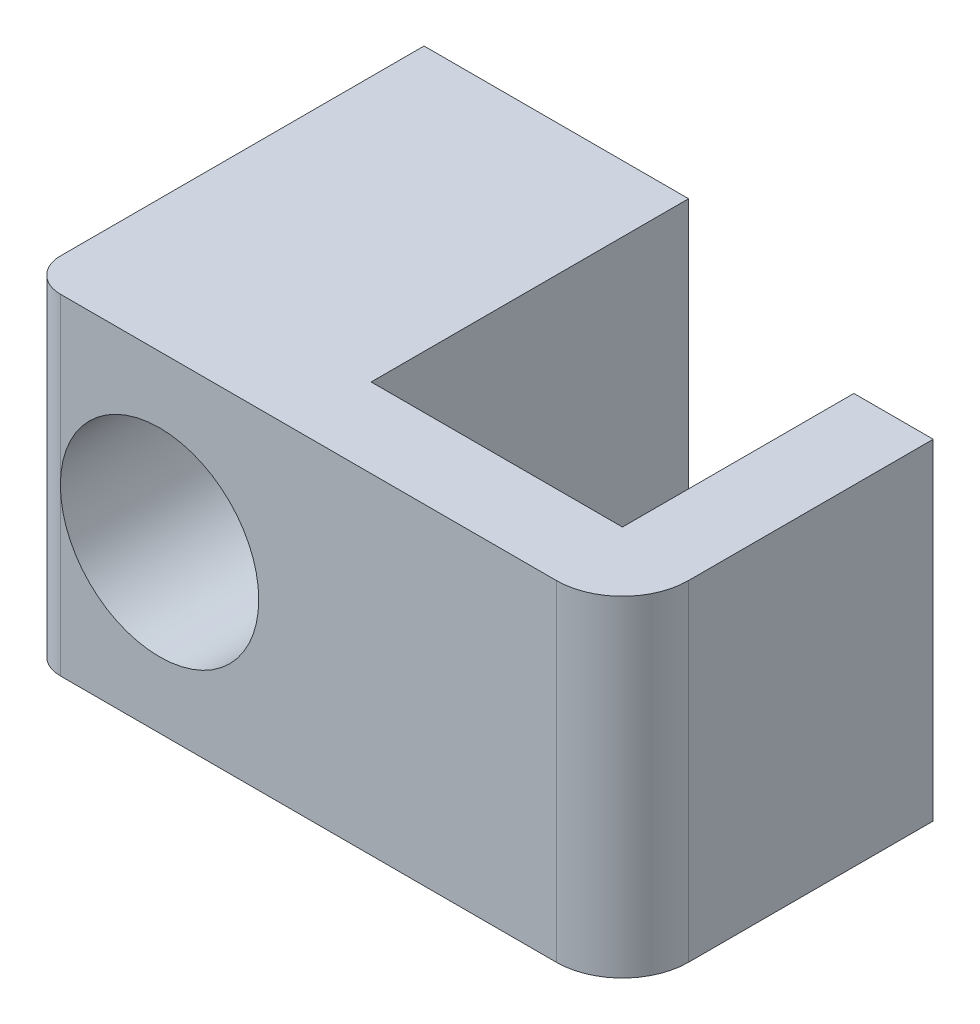
ISO-10303-21;
HEADER;
FILE_DESCRIPTION(('STEP AP214'),'2;1');
FILE_NAME('part.step','',(''),(''),'','','');
FILE_SCHEMA(('AUTOMOTIVE_DESIGN { 1 0 10303 214 1 1 1 1 }'));
ENDSEC;
DATA;
#1=APPLICATION_CONTEXT('core data for automotive mechanical design processes');
#2=APPLICATION_PROTOCOL_DEFINITION('international standard','automotive_design',2000,#1);
#3=PRODUCT_CONTEXT('',#1,'mechanical');
#4=PRODUCT('Part','Part','',(#3));
#5=PRODUCT_RELATED_PRODUCT_CATEGORY('part','',(#4));
#6=PRODUCT_DEFINITION_FORMATION('','',#4);
#7=PRODUCT_DEFINITION_CONTEXT('part definition',#1,'design');
#8=PRODUCT_DEFINITION('design','',#6,#7);
#9=PRODUCT_DEFINITION_SHAPE('','',#8);
#10=(LENGTH_UNIT() NAMED_UNIT(*) SI_UNIT(.MILLI.,.METRE.));
#11=(NAMED_UNIT(*) PLANE_ANGLE_UNIT() SI_UNIT($,.RADIAN.));
#12=(NAMED_UNIT(*) SI_UNIT($,.STERADIAN.) SOLID_ANGLE_UNIT());
#13=UNCERTAINTY_MEASURE_WITH_UNIT(LENGTH_MEASURE(1.E-05),#10,'distance_accuracy_value','');
#14=(GEOMETRIC_REPRESENTATION_CONTEXT(3) GLOBAL_UNCERTAINTY_ASSIGNED_CONTEXT((#13)) GLOBAL_UNIT_ASSIGNED_CONTEXT((#10,
#11,#12)) REPRESENTATION_CONTEXT('',''));
#15=CARTESIAN_POINT('',(0.,0.,0.));
#16=DIRECTION('',(0.,0.,1.));
#17=DIRECTION('',(1.,0.,0.));
#18=AXIS2_PLACEMENT_3D('',#15,#16,#17);
#19=CARTESIAN_POINT('',(7.,2.5,4.8));
#20=DIRECTION('',(0.,0.,1.));
#21=DIRECTION('',(0.,-1.,0.));
#22=AXIS2_PLACEMENT_3D('',#19,#20,#21);
#23=PLANE('',#22);
#24=DIRECTION('',(0.,1.,0.));
#25=VECTOR('',#24,1.);
#26=CARTESIAN_POINT('',(5.8,2.5,4.8));
#27=LINE('',#26,#25);
#28=CARTESIAN_POINT('',(5.8,-2.5,4.8));
#29=VERTEX_POINT('',#28);
#30=CARTESIAN_POINT('',(5.8,2.5,4.8));
#31=VERTEX_POINT('',#30);
#32=EDGE_CURVE('E139',#29,#31,#27,.T.);
#33=ORIENTED_EDGE('',*,*,#32,.F.);
#34=DIRECTION('',(-1.,0.,0.));
#35=VECTOR('',#34,1.);
#36=CARTESIAN_POINT('',(7.,-2.5,4.8));
#37=LINE('',#36,#35);
#38=CARTESIAN_POINT('',(2.,-2.5,4.8));
#39=VERTEX_POINT('',#38);
#40=EDGE_CURVE('E170',#29,#39,#37,.T.);
#41=ORIENTED_EDGE('',*,*,#40,.T.);
#42=DIRECTION('',(0.,1.,0.));
#43=VECTOR('',#42,1.);
#44=CARTESIAN_POINT('',(2.,2.5,4.8));
#45=LINE('',#44,#43);
#46=CARTESIAN_POINT('',(2.,2.5,4.8));
#47=VERTEX_POINT('',#46);
#48=EDGE_CURVE('E152',#39,#47,#45,.T.);
#49=ORIENTED_EDGE('',*,*,#48,.T.);
#50=DIRECTION('',(-1.,0.,0.));
#51=VECTOR('',#50,1.);
#52=CARTESIAN_POINT('',(7.,2.5,4.8));
#53=LINE('',#52,#51);
#54=EDGE_CURVE('E123',#31,#47,#53,.T.);
#55=ORIENTED_EDGE('',*,*,#54,.F.);
#56=EDGE_LOOP('',(#33,#41,#49,#55));
#57=FACE_BOUND('',#56,.T.);
#58=ADVANCED_FACE('F34',(#57),#23,.F.);
#59=CARTESIAN_POINT('',(2.,-2.5,6.));
#60=DIRECTION('',(-1.,0.,0.));
#61=DIRECTION('',(0.,0.,1.));
#62=AXIS2_PLACEMENT_3D('',#59,#60,#61);
#63=PLANE('',#62);
#64=ORIENTED_EDGE('',*,*,#48,.F.);
#65=DIRECTION('',(0.,0.,-1.));
#66=VECTOR('',#65,1.);
#67=CARTESIAN_POINT('',(2.,-2.5,6.));
#68=LINE('',#67,#66);
#69=CARTESIAN_POINT('',(2.,-2.5,0.));
#70=VERTEX_POINT('',#69);
#71=EDGE_CURVE('E162',#39,#70,#68,.T.);
#72=ORIENTED_EDGE('',*,*,#71,.T.);
#73=DIRECTION('',(0.,1.,0.));
#74=VECTOR('',#73,1.);
#75=CARTESIAN_POINT('',(2.,-2.5,0.));
#76=LINE('',#75,#74);
#77=CARTESIAN_POINT('',(2.,2.5,0.));
#78=VERTEX_POINT('',#77);
#79=EDGE_CURVE('E172',#70,#78,#76,.T.);
#80=ORIENTED_EDGE('',*,*,#79,.T.);
#81=DIRECTION('',(0.,0.,-1.));
#82=VECTOR('',#81,1.);
#83=CARTESIAN_POINT('',(2.,2.5,6.));
#84=LINE('',#83,#82);
#85=EDGE_CURVE('E175',#47,#78,#84,.T.);
#86=ORIENTED_EDGE('',*,*,#85,.F.);
#87=EDGE_LOOP('',(#64,#72,#80,#86));
#88=FACE_BOUND('',#87,.T.);
#89=ADVANCED_FACE('F210',(#88),#63,.F.);
#90=CARTESIAN_POINT('',(-2.,2.5,6.));
#91=DIRECTION('',(0.,-1.,0.));
#92=DIRECTION('',(0.,0.,-1.));
#93=AXIS2_PLACEMENT_3D('',#90,#91,#92);
#94=PLANE('',#93);
#95=DIRECTION('',(0.,0.,-1.));
#96=VECTOR('',#95,1.);
#97=CARTESIAN_POINT('',(-2.,2.5,6.));
#98=LINE('',#97,#96);
#99=CARTESIAN_POINT('',(-2.,2.5,5.5));
#100=VERTEX_POINT('',#99);
#101=CARTESIAN_POINT('',(-2.,2.5,0.));
#102=VERTEX_POINT('',#101);
#103=EDGE_CURVE('E239',#100,#102,#98,.T.);
#104=ORIENTED_EDGE('',*,*,#103,.F.);
#105=CARTESIAN_POINT('',(-1.5,2.5,5.5));
#106=DIRECTION('',(0.,-1.,0.));
#107=DIRECTION('',(0.,0.,-1.));
#108=AXIS2_PLACEMENT_3D('',#105,#106,#107);
#109=CIRCLE('',#108,0.5);
#110=CARTESIAN_POINT('',(-1.5,2.5,6.));
#111=VERTEX_POINT('',#110);
#112=EDGE_CURVE('E11',#100,#111,#109,.F.);
#113=ORIENTED_EDGE('',*,*,#112,.T.);
#114=DIRECTION('',(-1.,0.,0.));
#115=VECTOR('',#114,1.);
#116=CARTESIAN_POINT('',(-2.,2.5,6.));
#117=LINE('',#116,#115);
#118=CARTESIAN_POINT('',(6.,2.5,6.));
#119=VERTEX_POINT('',#118);
#120=EDGE_CURVE('E156',#119,#111,#117,.T.);
#121=ORIENTED_EDGE('',*,*,#120,.F.);
#122=CARTESIAN_POINT('',(6.,2.5,5.));
#123=DIRECTION('',(0.,-1.,0.));
#124=DIRECTION('',(0.,0.,-1.));
#125=AXIS2_PLACEMENT_3D('',#122,#123,#124);
#126=CIRCLE('',#125,1.);
#127=CARTESIAN_POINT('',(7.,2.5,5.));
#128=VERTEX_POINT('',#127);
#129=EDGE_CURVE('E179',#119,#128,#126,.F.);
#130=ORIENTED_EDGE('',*,*,#129,.T.);
#131=DIRECTION('',(0.,0.,1.));
#132=VECTOR('',#131,1.);
#133=CARTESIAN_POINT('',(7.,2.5,6.));
#134=LINE('',#133,#132);
#135=CARTESIAN_POINT('',(7.,2.5,1.3));
#136=VERTEX_POINT('',#135);
#137=EDGE_CURVE('E124',#136,#128,#134,.T.);
#138=ORIENTED_EDGE('',*,*,#137,.F.);
#139=DIRECTION('',(1.,0.,0.));
#140=VECTOR('',#139,1.);
#141=CARTESIAN_POINT('',(7.,2.5,1.3));
#142=LINE('',#141,#140);
#143=CARTESIAN_POINT('',(5.8,2.5,1.3));
#144=VERTEX_POINT('',#143);
#145=EDGE_CURVE('E138',#144,#136,#142,.T.);
#146=ORIENTED_EDGE('',*,*,#145,.F.);
#147=DIRECTION('',(0.,0.,1.));
#148=VECTOR('',#147,1.);
#149=CARTESIAN_POINT('',(5.8,2.5,1.3));
#150=LINE('',#149,#148);
#151=EDGE_CURVE('E147',#144,#31,#150,.T.);
#152=ORIENTED_EDGE('',*,*,#151,.T.);
#153=ORIENTED_EDGE('',*,*,#54,.T.);
#154=ORIENTED_EDGE('',*,*,#85,.T.);
#155=DIRECTION('',(-1.,0.,0.));
#156=VECTOR('',#155,1.);
#157=CARTESIAN_POINT('',(-2.,2.5,0.));
#158=LINE('',#157,#156);
#159=EDGE_CURVE('E241',#78,#102,#158,.T.);
#160=ORIENTED_EDGE('',*,*,#159,.T.);
#161=EDGE_LOOP('',(#104,#113,#121,#130,#138,#146,#152,#153,#154,#160));
#162=FACE_BOUND('',#161,.T.);
#163=ADVANCED_FACE('F216',(#162),#94,.F.);
#164=CARTESIAN_POINT('',(-2.,-2.5,6.));
#165=DIRECTION('',(1.,0.,0.));
#166=DIRECTION('',(0.,0.,-1.));
#167=AXIS2_PLACEMENT_3D('',#164,#165,#166);
#168=PLANE('',#167);
#169=DIRECTION('',(0.,0.,-1.));
#170=VECTOR('',#169,1.);
#171=CARTESIAN_POINT('',(-2.,-2.5,6.));
#172=LINE('',#171,#170);
#173=CARTESIAN_POINT('',(-2.,-2.5,5.5));
#174=VERTEX_POINT('',#173);
#175=CARTESIAN_POINT('',(-2.,-2.5,0.));
#176=VERTEX_POINT('',#175);
#177=EDGE_CURVE('E244',#174,#176,#172,.T.);
#178=ORIENTED_EDGE('',*,*,#177,.F.);
#179=DIRECTION('',(0.,-1.,0.));
#180=VECTOR('',#179,1.);
#181=CARTESIAN_POINT('',(-2.,-2.5,5.5));
#182=LINE('',#181,#180);
#183=EDGE_CURVE('E42',#174,#100,#182,.F.);
#184=ORIENTED_EDGE('',*,*,#183,.T.);
#185=ORIENTED_EDGE('',*,*,#103,.T.);
#186=DIRECTION('',(0.,-1.,0.));
#187=VECTOR('',#186,1.);
#188=CARTESIAN_POINT('',(-2.,-2.5,0.));
#189=LINE('',#188,#187);
#190=EDGE_CURVE('E253',#102,#176,#189,.T.);
#191=ORIENTED_EDGE('',*,*,#190,.T.);
#192=EDGE_LOOP('',(#178,#184,#185,#191));
#193=FACE_BOUND('',#192,.T.);
#194=ADVANCED_FACE('F231',(#193),#168,.F.);
#195=CARTESIAN_POINT('',(-2.,-2.5,6.));
#196=DIRECTION('',(0.,1.,0.));
#197=DIRECTION('',(0.,0.,1.));
#198=AXIS2_PLACEMENT_3D('',#195,#196,#197);
#199=PLANE('',#198);
#200=DIRECTION('',(1.,0.,0.));
#201=VECTOR('',#200,1.);
#202=CARTESIAN_POINT('',(-2.,-2.5,6.));
#203=LINE('',#202,#201);
#204=CARTESIAN_POINT('',(-1.5,-2.5,6.));
#205=VERTEX_POINT('',#204);
#206=CARTESIAN_POINT('',(6.,-2.5,6.));
#207=VERTEX_POINT('',#206);
#208=EDGE_CURVE('E246',#205,#207,#203,.T.);
#209=ORIENTED_EDGE('',*,*,#208,.F.);
#210=CARTESIAN_POINT('',(-1.5,-2.5,5.5));
#211=DIRECTION('',(0.,1.,0.));
#212=DIRECTION('',(0.,0.,1.));
#213=AXIS2_PLACEMENT_3D('',#210,#211,#212);
#214=CIRCLE('',#213,0.5);
#215=EDGE_CURVE('E56',#205,#174,#214,.F.);
#216=ORIENTED_EDGE('',*,*,#215,.T.);
#217=ORIENTED_EDGE('',*,*,#177,.T.);
#218=DIRECTION('',(1.,0.,0.));
#219=VECTOR('',#218,1.);
#220=CARTESIAN_POINT('',(-2.,-2.5,0.));
#221=LINE('',#220,#219);
#222=EDGE_CURVE('E248',#176,#70,#221,.T.);
#223=ORIENTED_EDGE('',*,*,#222,.T.);
#224=ORIENTED_EDGE('',*,*,#71,.F.);
#225=ORIENTED_EDGE('',*,*,#40,.F.);
#226=DIRECTION('',(0.,0.,1.));
#227=VECTOR('',#226,1.);
#228=CARTESIAN_POINT('',(5.8,-2.5,1.3));
#229=LINE('',#228,#227);
#230=CARTESIAN_POINT('',(5.8,-2.5,1.3));
#231=VERTEX_POINT('',#230);
#232=EDGE_CURVE('E130',#231,#29,#229,.T.);
#233=ORIENTED_EDGE('',*,*,#232,.F.);
#234=DIRECTION('',(-1.,0.,0.));
#235=VECTOR('',#234,1.);
#236=CARTESIAN_POINT('',(5.8,-2.5,1.3));
#237=LINE('',#236,#235);
#238=CARTESIAN_POINT('',(7.,-2.5,1.3));
#239=VERTEX_POINT('',#238);
#240=EDGE_CURVE('E127',#239,#231,#237,.T.);
#241=ORIENTED_EDGE('',*,*,#240,.F.);
#242=DIRECTION('',(0.,0.,-1.));
#243=VECTOR('',#242,1.);
#244=CARTESIAN_POINT('',(7.,-2.5,4.8));
#245=LINE('',#244,#243);
#246=CARTESIAN_POINT('',(7.,-2.5,5.));
#247=VERTEX_POINT('',#246);
#248=EDGE_CURVE('E114',#247,#239,#245,.T.);
#249=ORIENTED_EDGE('',*,*,#248,.F.);
#250=CARTESIAN_POINT('',(6.,-2.5,5.));
#251=DIRECTION('',(0.,1.,0.));
#252=DIRECTION('',(0.,0.,1.));
#253=AXIS2_PLACEMENT_3D('',#250,#251,#252);
#254=CIRCLE('',#253,1.);
#255=EDGE_CURVE('E174',#247,#207,#254,.F.);
#256=ORIENTED_EDGE('',*,*,#255,.T.);
#257=EDGE_LOOP('',(#209,#216,#217,#223,#224,#225,#233,#241,#249,#256));
#258=FACE_BOUND('',#257,.T.);
#259=ADVANCED_FACE('F128',(#258),#199,.F.);
#260=CARTESIAN_POINT('',(2.,2.5,6.));
#261=DIRECTION('',(0.,0.,-1.));
#262=DIRECTION('',(-1.,0.,0.));
#263=AXIS2_PLACEMENT_3D('',#260,#261,#262);
#264=PLANE('',#263);
#265=ORIENTED_EDGE('',*,*,#120,.T.);
#266=DIRECTION('',(0.,-1.,0.));
#267=VECTOR('',#266,1.);
#268=CARTESIAN_POINT('',(-1.5,2.5,6.));
#269=LINE('',#268,#267);
#270=CARTESIAN_POINT('',(-1.5,0.,6.));
#271=VERTEX_POINT('',#270);
#272=EDGE_CURVE('E185',#111,#271,#269,.T.);
#273=ORIENTED_EDGE('',*,*,#272,.T.);
#274=CARTESIAN_POINT('',(0.,0.,6.));
#275=DIRECTION('',(0.,0.,1.));
#276=DIRECTION('',(1.,0.,0.));
#277=AXIS2_PLACEMENT_3D('',#274,#275,#276);
#278=CIRCLE('',#277,1.5);
#279=EDGE_CURVE('E144',#271,#271,#278,.T.);
#280=ORIENTED_EDGE('',*,*,#279,.F.);
#281=DIRECTION('',(0.,-1.,0.));
#282=VECTOR('',#281,1.);
#283=CARTESIAN_POINT('',(-1.5,2.5,6.));
#284=LINE('',#283,#282);
#285=EDGE_CURVE('E181',#271,#205,#284,.T.);
#286=ORIENTED_EDGE('',*,*,#285,.T.);
#287=ORIENTED_EDGE('',*,*,#208,.T.);
#288=DIRECTION('',(0.,-1.,0.));
#289=VECTOR('',#288,1.);
#290=CARTESIAN_POINT('',(6.,2.5,6.));
#291=LINE('',#290,#289);
#292=EDGE_CURVE('E177',#207,#119,#291,.F.);
#293=ORIENTED_EDGE('',*,*,#292,.T.);
#294=EDGE_LOOP('',(#265,#273,#280,#286,#287,#293));
#295=FACE_BOUND('',#294,.T.);
#296=ADVANCED_FACE('F193',(#295),#264,.F.);
#297=CARTESIAN_POINT('',(2.,2.5,0.));
#298=DIRECTION('',(0.,0.,-1.));
#299=DIRECTION('',(-1.,0.,0.));
#300=AXIS2_PLACEMENT_3D('',#297,#298,#299);
#301=PLANE('',#300);
#302=CARTESIAN_POINT('',(0.,0.,0.));
#303=DIRECTION('',(0.,0.,-1.));
#304=DIRECTION('',(-1.,0.,0.));
#305=AXIS2_PLACEMENT_3D('',#302,#303,#304);
#306=CIRCLE('',#305,1.5);
#307=CARTESIAN_POINT('',(-1.5,0.,0.));
#308=VERTEX_POINT('',#307);
#309=EDGE_CURVE('E141',#308,#308,#306,.T.);
#310=ORIENTED_EDGE('',*,*,#309,.F.);
#311=EDGE_LOOP('',(#310));
#312=FACE_BOUND('',#311,.T.);
#313=ORIENTED_EDGE('',*,*,#79,.F.);
#314=ORIENTED_EDGE('',*,*,#222,.F.);
#315=ORIENTED_EDGE('',*,*,#190,.F.);
#316=ORIENTED_EDGE('',*,*,#159,.F.);
#317=EDGE_LOOP('',(#313,#314,#315,#316));
#318=FACE_BOUND('',#317,.T.);
#319=ADVANCED_FACE('F225',(#312,#318),#301,.T.);
#320=CARTESIAN_POINT('',(7.,2.5,4.8));
#321=DIRECTION('',(-1.,0.,0.));
#322=DIRECTION('',(0.,0.,1.));
#323=AXIS2_PLACEMENT_3D('',#320,#321,#322);
#324=PLANE('',#323);
#325=ORIENTED_EDGE('',*,*,#137,.T.);
#326=DIRECTION('',(0.,-1.,0.));
#327=VECTOR('',#326,1.);
#328=CARTESIAN_POINT('',(7.,2.5,5.));
#329=LINE('',#328,#327);
#330=EDGE_CURVE('E121',#128,#247,#329,.T.);
#331=ORIENTED_EDGE('',*,*,#330,.T.);
#332=ORIENTED_EDGE('',*,*,#248,.T.);
#333=DIRECTION('',(0.,-1.,0.));
#334=VECTOR('',#333,1.);
#335=CARTESIAN_POINT('',(7.,-2.5,1.3));
#336=LINE('',#335,#334);
#337=EDGE_CURVE('E119',#136,#239,#336,.T.);
#338=ORIENTED_EDGE('',*,*,#337,.F.);
#339=EDGE_LOOP('',(#325,#331,#332,#338));
#340=FACE_BOUND('',#339,.T.);
#341=ADVANCED_FACE('F117',(#340),#324,.F.);
#342=CARTESIAN_POINT('',(5.8,2.5,1.3));
#343=DIRECTION('',(1.,0.,0.));
#344=DIRECTION('',(0.,1.,0.));
#345=AXIS2_PLACEMENT_3D('',#342,#343,#344);
#346=PLANE('',#345);
#347=ORIENTED_EDGE('',*,*,#32,.T.);
#348=ORIENTED_EDGE('',*,*,#151,.F.);
#349=DIRECTION('',(0.,1.,0.));
#350=VECTOR('',#349,1.);
#351=CARTESIAN_POINT('',(5.8,2.5,1.3));
#352=LINE('',#351,#350);
#353=EDGE_CURVE('E133',#231,#144,#352,.T.);
#354=ORIENTED_EDGE('',*,*,#353,.F.);
#355=ORIENTED_EDGE('',*,*,#232,.T.);
#356=EDGE_LOOP('',(#347,#348,#354,#355));
#357=FACE_BOUND('',#356,.T.);
#358=ADVANCED_FACE('F269',(#357),#346,.F.);
#359=CARTESIAN_POINT('',(7.,2.5,1.3));
#360=DIRECTION('',(0.,0.,1.));
#361=DIRECTION('',(0.,-1.,0.));
#362=AXIS2_PLACEMENT_3D('',#359,#360,#361);
#363=PLANE('',#362);
#364=ORIENTED_EDGE('',*,*,#337,.T.);
#365=ORIENTED_EDGE('',*,*,#240,.T.);
#366=ORIENTED_EDGE('',*,*,#353,.T.);
#367=ORIENTED_EDGE('',*,*,#145,.T.);
#368=EDGE_LOOP('',(#364,#365,#366,#367));
#369=FACE_BOUND('',#368,.T.);
#370=ADVANCED_FACE('F136',(#369),#363,.F.);
#371=CARTESIAN_POINT('',(6.,2.5,5.));
#372=DIRECTION('',(0.,-1.,0.));
#373=DIRECTION('',(0.,0.,-1.));
#374=AXIS2_PLACEMENT_3D('',#371,#372,#373);
#375=CYLINDRICAL_SURFACE('',#374,1.);
#376=ORIENTED_EDGE('',*,*,#129,.F.);
#377=ORIENTED_EDGE('',*,*,#292,.F.);
#378=ORIENTED_EDGE('',*,*,#255,.F.);
#379=ORIENTED_EDGE('',*,*,#330,.F.);
#380=EDGE_LOOP('',(#376,#377,#378,#379));
#381=FACE_BOUND('',#380,.T.);
#382=ADVANCED_FACE('F200',(#381),#375,.T.);
#383=CARTESIAN_POINT('',(0.,0.,-2.49999999998515E-05));
#384=DIRECTION('',(0.,0.,1.));
#385=DIRECTION('',(1.,0.,0.));
#386=AXIS2_PLACEMENT_3D('',#383,#384,#385);
#387=CYLINDRICAL_SURFACE('',#386,1.5);
#388=ORIENTED_EDGE('',*,*,#309,.T.);
#389=EDGE_LOOP('',(#388));
#390=FACE_BOUND('',#389,.T.);
#391=ORIENTED_EDGE('',*,*,#279,.T.);
#392=EDGE_LOOP('',(#391));
#393=FACE_BOUND('',#392,.T.);
#394=ADVANCED_FACE('F198',(#390,#393),#387,.F.);
#395=CARTESIAN_POINT('',(-1.5,2.5,5.5));
#396=DIRECTION('',(0.,-1.,0.));
#397=DIRECTION('',(0.,0.,-1.));
#398=AXIS2_PLACEMENT_3D('',#395,#396,#397);
#399=CYLINDRICAL_SURFACE('',#398,0.5);
#400=ORIENTED_EDGE('',*,*,#112,.F.);
#401=ORIENTED_EDGE('',*,*,#183,.F.);
#402=ORIENTED_EDGE('',*,*,#215,.F.);
#403=ORIENTED_EDGE('',*,*,#285,.F.);
#404=ORIENTED_EDGE('',*,*,#272,.F.);
#405=EDGE_LOOP('',(#400,#401,#402,#403,#404));
#406=FACE_BOUND('',#405,.T.);
#407=ADVANCED_FACE('F36',(#406),#399,.T.);
#408=CLOSED_SHELL('',(#58,#89,#163,#194,#259,#296,#319,#341,#358,#370,#382,#394,#407));
#409=MANIFOLD_SOLID_BREP('B2',#408);
#410=ADVANCED_BREP_SHAPE_REPRESENTATION('',(#18,#409),#14);
#411=SHAPE_DEFINITION_REPRESENTATION(#9,#410);
ENDSEC;
END-ISO-10303-21;
